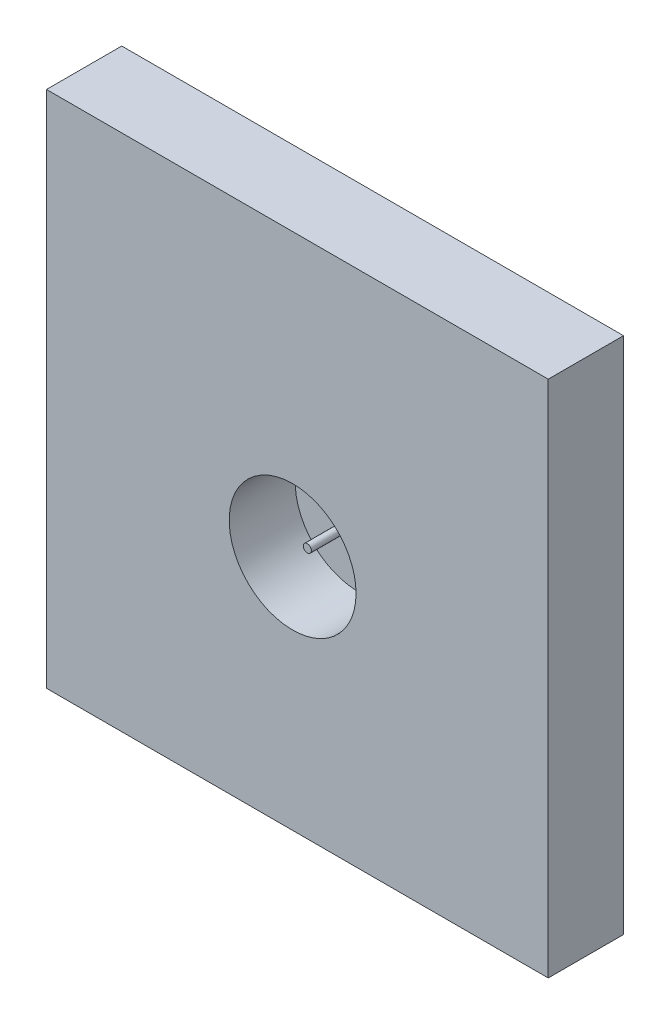
ISO-10303-21;
HEADER;
FILE_DESCRIPTION(('STEP AP214'),'2;1');
FILE_NAME('part.step','',(''),(''),'','','');
FILE_SCHEMA(('AUTOMOTIVE_DESIGN { 1 0 10303 214 1 1 1 1 }'));
ENDSEC;
DATA;
#1=APPLICATION_CONTEXT('core data for automotive mechanical design processes');
#2=APPLICATION_PROTOCOL_DEFINITION('international standard','automotive_design',2000,#1);
#3=PRODUCT_CONTEXT('',#1,'mechanical');
#4=PRODUCT('Part','Part','',(#3));
#5=PRODUCT_RELATED_PRODUCT_CATEGORY('part','',(#4));
#6=PRODUCT_DEFINITION_FORMATION('','',#4);
#7=PRODUCT_DEFINITION_CONTEXT('part definition',#1,'design');
#8=PRODUCT_DEFINITION('design','',#6,#7);
#9=PRODUCT_DEFINITION_SHAPE('','',#8);
#10=(LENGTH_UNIT() NAMED_UNIT(*) SI_UNIT(.MILLI.,.METRE.));
#11=(NAMED_UNIT(*) PLANE_ANGLE_UNIT() SI_UNIT($,.RADIAN.));
#12=(NAMED_UNIT(*) SI_UNIT($,.STERADIAN.) SOLID_ANGLE_UNIT());
#13=UNCERTAINTY_MEASURE_WITH_UNIT(LENGTH_MEASURE(1.E-05),#10,'distance_accuracy_value','');
#14=(GEOMETRIC_REPRESENTATION_CONTEXT(3) GLOBAL_UNCERTAINTY_ASSIGNED_CONTEXT((#13)) GLOBAL_UNIT_ASSIGNED_CONTEXT((#10,
#11,#12)) REPRESENTATION_CONTEXT('',''));
#15=CARTESIAN_POINT('',(0.,0.,0.));
#16=DIRECTION('',(0.,0.,1.));
#17=DIRECTION('',(1.,0.,0.));
#18=AXIS2_PLACEMENT_3D('',#15,#16,#17);
#19=CARTESIAN_POINT('',(-4329.,-6167.65165651162,943.51077616825));
#20=DIRECTION('',(0.,0.,1.));
#21=DIRECTION('',(1.,0.,0.));
#22=AXIS2_PLACEMENT_3D('',#19,#20,#21);
#23=PLANE('',#22);
#24=CARTESIAN_POINT('',(833.930631375601,-1197.16637306014,943.51077616825));
#25=DIRECTION('',(0.,0.,1.));
#26=DIRECTION('',(1.,0.,0.));
#27=AXIS2_PLACEMENT_3D('',#24,#25,#26);
#28=CIRCLE('',#27,1330.44932834744);
#29=CARTESIAN_POINT('',(2164.37995972304,-1197.16637306014,943.51077616825));
#30=VERTEX_POINT('',#29);
#31=EDGE_CURVE('E99',#30,#30,#28,.T.);
#32=ORIENTED_EDGE('',*,*,#31,.F.);
#33=EDGE_LOOP('',(#32));
#34=FACE_BOUND('',#33,.T.);
#35=DIRECTION('',(1.,0.,0.));
#36=VECTOR('',#35,1.);
#37=CARTESIAN_POINT('',(-4329.,-6167.65165651162,943.51077616825));
#38=LINE('',#37,#36);
#39=CARTESIAN_POINT('',(-4329.,-6167.65165651162,943.51077616825));
#40=VERTEX_POINT('',#39);
#41=CARTESIAN_POINT('',(6196.,-6167.65165651162,943.51077616825));
#42=VERTEX_POINT('',#41);
#43=EDGE_CURVE('E75',#40,#42,#38,.T.);
#44=ORIENTED_EDGE('',*,*,#43,.T.);
#45=DIRECTION('',(0.,-1.,0.));
#46=VECTOR('',#45,1.);
#47=CARTESIAN_POINT('',(6196.,-6167.65165651162,943.51077616825));
#48=LINE('',#47,#46);
#49=CARTESIAN_POINT('',(6196.,4711.30994980544,943.51077616825));
#50=VERTEX_POINT('',#49);
#51=EDGE_CURVE('E78',#50,#42,#48,.T.);
#52=ORIENTED_EDGE('',*,*,#51,.F.);
#53=DIRECTION('',(1.,0.,0.));
#54=VECTOR('',#53,1.);
#55=CARTESIAN_POINT('',(-4329.,4711.30994980544,943.51077616825));
#56=LINE('',#55,#54);
#57=CARTESIAN_POINT('',(-4329.,4711.30994980544,943.51077616825));
#58=VERTEX_POINT('',#57);
#59=EDGE_CURVE('E44',#58,#50,#56,.T.);
#60=ORIENTED_EDGE('',*,*,#59,.F.);
#61=DIRECTION('',(0.,-1.,0.));
#62=VECTOR('',#61,1.);
#63=CARTESIAN_POINT('',(-4329.,-6167.65165651162,943.51077616825));
#64=LINE('',#63,#62);
#65=EDGE_CURVE('E79',#58,#40,#64,.T.);
#66=ORIENTED_EDGE('',*,*,#65,.T.);
#67=EDGE_LOOP('',(#44,#52,#60,#66));
#68=FACE_BOUND('',#67,.T.);
#69=ADVANCED_FACE('F37',(#34,#68),#23,.T.);
#70=CARTESIAN_POINT('',(-4329.,4711.30994980544,943.51077616825));
#71=DIRECTION('',(0.,1.,0.));
#72=DIRECTION('',(0.,0.,1.));
#73=AXIS2_PLACEMENT_3D('',#70,#71,#72);
#74=PLANE('',#73);
#75=ORIENTED_EDGE('',*,*,#59,.T.);
#76=DIRECTION('',(0.,0.,1.));
#77=VECTOR('',#76,1.);
#78=CARTESIAN_POINT('',(6196.,4711.30994980544,943.51077616825));
#79=LINE('',#78,#77);
#80=CARTESIAN_POINT('',(6196.,4711.30994980544,-635.191200499874));
#81=VERTEX_POINT('',#80);
#82=EDGE_CURVE('E95',#81,#50,#79,.T.);
#83=ORIENTED_EDGE('',*,*,#82,.F.);
#84=DIRECTION('',(1.,0.,0.));
#85=VECTOR('',#84,1.);
#86=CARTESIAN_POINT('',(-4329.,4711.30994980544,-635.191200499874));
#87=LINE('',#86,#85);
#88=CARTESIAN_POINT('',(-4329.,4711.30994980544,-635.191200499874));
#89=VERTEX_POINT('',#88);
#90=EDGE_CURVE('E58',#89,#81,#87,.T.);
#91=ORIENTED_EDGE('',*,*,#90,.F.);
#92=DIRECTION('',(0.,0.,1.));
#93=VECTOR('',#92,1.);
#94=CARTESIAN_POINT('',(-4329.,4711.30994980544,943.51077616825));
#95=LINE('',#94,#93);
#96=EDGE_CURVE('E84',#89,#58,#95,.T.);
#97=ORIENTED_EDGE('',*,*,#96,.T.);
#98=EDGE_LOOP('',(#75,#83,#91,#97));
#99=FACE_BOUND('',#98,.T.);
#100=ADVANCED_FACE('F117',(#99),#74,.T.);
#101=CARTESIAN_POINT('',(-4329.,-6167.65165651162,-635.191200499874));
#102=DIRECTION('',(0.,0.,-1.));
#103=DIRECTION('',(0.,1.,0.));
#104=AXIS2_PLACEMENT_3D('',#101,#102,#103);
#105=PLANE('',#104);
#106=ORIENTED_EDGE('',*,*,#90,.T.);
#107=DIRECTION('',(0.,1.,0.));
#108=VECTOR('',#107,1.);
#109=CARTESIAN_POINT('',(6196.,-6167.65165651162,-635.191200499874));
#110=LINE('',#109,#108);
#111=CARTESIAN_POINT('',(6196.,-6167.65165651162,-635.191200499874));
#112=VERTEX_POINT('',#111);
#113=EDGE_CURVE('E91',#112,#81,#110,.T.);
#114=ORIENTED_EDGE('',*,*,#113,.F.);
#115=DIRECTION('',(1.,0.,0.));
#116=VECTOR('',#115,1.);
#117=CARTESIAN_POINT('',(-4329.,-6167.65165651162,-635.191200499874));
#118=LINE('',#117,#116);
#119=CARTESIAN_POINT('',(-4329.,-6167.65165651162,-635.191200499874));
#120=VERTEX_POINT('',#119);
#121=EDGE_CURVE('E83',#120,#112,#118,.T.);
#122=ORIENTED_EDGE('',*,*,#121,.F.);
#123=DIRECTION('',(0.,1.,0.));
#124=VECTOR('',#123,1.);
#125=CARTESIAN_POINT('',(-4329.,-6167.65165651162,-635.191200499874));
#126=LINE('',#125,#124);
#127=EDGE_CURVE('E108',#120,#89,#126,.T.);
#128=ORIENTED_EDGE('',*,*,#127,.T.);
#129=EDGE_LOOP('',(#106,#114,#122,#128));
#130=FACE_BOUND('',#129,.T.);
#131=ADVANCED_FACE('F114',(#130),#105,.T.);
#132=CARTESIAN_POINT('',(-4329.,-6167.65165651162,943.51077616825));
#133=DIRECTION('',(0.,-1.,0.));
#134=DIRECTION('',(0.,0.,-1.));
#135=AXIS2_PLACEMENT_3D('',#132,#133,#134);
#136=PLANE('',#135);
#137=ORIENTED_EDGE('',*,*,#121,.T.);
#138=DIRECTION('',(0.,0.,-1.));
#139=VECTOR('',#138,1.);
#140=CARTESIAN_POINT('',(6196.,-6167.65165651162,943.51077616825));
#141=LINE('',#140,#139);
#142=EDGE_CURVE('E86',#42,#112,#141,.T.);
#143=ORIENTED_EDGE('',*,*,#142,.F.);
#144=ORIENTED_EDGE('',*,*,#43,.F.);
#145=DIRECTION('',(0.,0.,-1.));
#146=VECTOR('',#145,1.);
#147=CARTESIAN_POINT('',(-4329.,-6167.65165651162,943.51077616825));
#148=LINE('',#147,#146);
#149=EDGE_CURVE('E106',#40,#120,#148,.T.);
#150=ORIENTED_EDGE('',*,*,#149,.T.);
#151=EDGE_LOOP('',(#137,#143,#144,#150));
#152=FACE_BOUND('',#151,.T.);
#153=ADVANCED_FACE('F87',(#152),#136,.T.);
#154=CARTESIAN_POINT('',(-4329.,0.,0.));
#155=DIRECTION('',(-1.,0.,0.));
#156=DIRECTION('',(0.,0.,1.));
#157=AXIS2_PLACEMENT_3D('',#154,#155,#156);
#158=PLANE('',#157);
#159=ORIENTED_EDGE('',*,*,#65,.F.);
#160=ORIENTED_EDGE('',*,*,#96,.F.);
#161=ORIENTED_EDGE('',*,*,#127,.F.);
#162=ORIENTED_EDGE('',*,*,#149,.F.);
#163=EDGE_LOOP('',(#159,#160,#161,#162));
#164=FACE_BOUND('',#163,.T.);
#165=ADVANCED_FACE('F119',(#164),#158,.T.);
#166=CARTESIAN_POINT('',(6196.,0.,0.));
#167=DIRECTION('',(-1.,0.,0.));
#168=DIRECTION('',(0.,0.,1.));
#169=AXIS2_PLACEMENT_3D('',#166,#167,#168);
#170=PLANE('',#169);
#171=ORIENTED_EDGE('',*,*,#51,.T.);
#172=ORIENTED_EDGE('',*,*,#142,.T.);
#173=ORIENTED_EDGE('',*,*,#113,.T.);
#174=ORIENTED_EDGE('',*,*,#82,.T.);
#175=EDGE_LOOP('',(#171,#172,#173,#174));
#176=FACE_BOUND('',#175,.T.);
#177=ADVANCED_FACE('F94',(#176),#170,.F.);
#178=CARTESIAN_POINT('',(833.930631375601,-1197.16637306014,-440.489223831748));
#179=DIRECTION('',(0.,0.,1.));
#180=DIRECTION('',(1.,0.,0.));
#181=AXIS2_PLACEMENT_3D('',#178,#179,#180);
#182=CYLINDRICAL_SURFACE('',#181,1330.44932834744);
#183=CARTESIAN_POINT('',(833.930631375601,-1197.16637306014,-440.489223831748));
#184=DIRECTION('',(0.,0.,1.));
#185=DIRECTION('',(1.,0.,0.));
#186=AXIS2_PLACEMENT_3D('',#183,#184,#185);
#187=CIRCLE('',#186,1330.44932834744);
#188=CARTESIAN_POINT('',(2164.37995972304,-1197.16637306014,-440.489223831748));
#189=VERTEX_POINT('',#188);
#190=EDGE_CURVE('E96',#189,#189,#187,.T.);
#191=ORIENTED_EDGE('',*,*,#190,.F.);
#192=EDGE_LOOP('',(#191));
#193=FACE_BOUND('',#192,.T.);
#194=ORIENTED_EDGE('',*,*,#31,.T.);
#195=EDGE_LOOP('',(#194));
#196=FACE_BOUND('',#195,.T.);
#197=ADVANCED_FACE('F126',(#193,#196),#182,.F.);
#198=CARTESIAN_POINT('',(833.930631375601,-1197.16637306014,-440.489223831748));
#199=DIRECTION('',(0.,0.,1.));
#200=DIRECTION('',(1.,0.,0.));
#201=AXIS2_PLACEMENT_3D('',#198,#199,#200);
#202=PLANE('',#201);
#203=CARTESIAN_POINT('',(833.930631375601,-1197.16637306014,-440.489223831748));
#204=DIRECTION('',(0.,0.,1.));
#205=DIRECTION('',(1.,0.,0.));
#206=AXIS2_PLACEMENT_3D('',#203,#204,#205);
#207=CIRCLE('',#206,84.807211279212);
#208=CARTESIAN_POINT('',(918.737842654813,-1197.16637306014,-440.489223831748));
#209=VERTEX_POINT('',#208);
#210=EDGE_CURVE('E11',#209,#209,#207,.T.);
#211=ORIENTED_EDGE('',*,*,#210,.F.);
#212=EDGE_LOOP('',(#211));
#213=FACE_BOUND('',#212,.T.);
#214=ORIENTED_EDGE('',*,*,#190,.T.);
#215=EDGE_LOOP('',(#214));
#216=FACE_BOUND('',#215,.T.);
#217=ADVANCED_FACE('F152',(#213,#216),#202,.T.);
#218=CARTESIAN_POINT('',(833.930631375601,-1197.16637306014,634.808799500124));
#219=DIRECTION('',(0.,0.,-1.));
#220=DIRECTION('',(0.,1.,0.));
#221=AXIS2_PLACEMENT_3D('',#218,#219,#220);
#222=CYLINDRICAL_SURFACE('',#221,84.807211279212);
#223=ORIENTED_EDGE('',*,*,#210,.T.);
#224=EDGE_LOOP('',(#223));
#225=FACE_BOUND('',#224,.T.);
#226=CARTESIAN_POINT('',(833.930631375601,-1197.16637306014,634.808799500124));
#227=DIRECTION('',(0.,0.,-1.));
#228=DIRECTION('',(0.,1.,0.));
#229=AXIS2_PLACEMENT_3D('',#226,#227,#228);
#230=CIRCLE('',#229,84.807211279212);
#231=CARTESIAN_POINT('',(833.930631375601,-1112.35916178093,634.808799500124));
#232=VERTEX_POINT('',#231);
#233=EDGE_CURVE('E139',#232,#232,#230,.T.);
#234=ORIENTED_EDGE('',*,*,#233,.T.);
#235=EDGE_LOOP('',(#234));
#236=FACE_BOUND('',#235,.T.);
#237=ADVANCED_FACE('F144',(#225,#236),#222,.T.);
#238=CARTESIAN_POINT('',(833.930631375601,-1197.16637306014,634.808799500124));
#239=DIRECTION('',(0.,0.,-1.));
#240=DIRECTION('',(0.,1.,0.));
#241=AXIS2_PLACEMENT_3D('',#238,#239,#240);
#242=PLANE('',#241);
#243=ORIENTED_EDGE('',*,*,#233,.F.);
#244=EDGE_LOOP('',(#243));
#245=FACE_BOUND('',#244,.T.);
#246=ADVANCED_FACE('F146',(#245),#242,.F.);
#247=CLOSED_SHELL('',(#69,#100,#131,#153,#165,#177,#197,#217,#237,#246));
#248=MANIFOLD_SOLID_BREP('B2',#247);
#249=ADVANCED_BREP_SHAPE_REPRESENTATION('',(#18,#248),#14);
#250=SHAPE_DEFINITION_REPRESENTATION(#9,#249);
ENDSEC;
END-ISO-10303-21;
